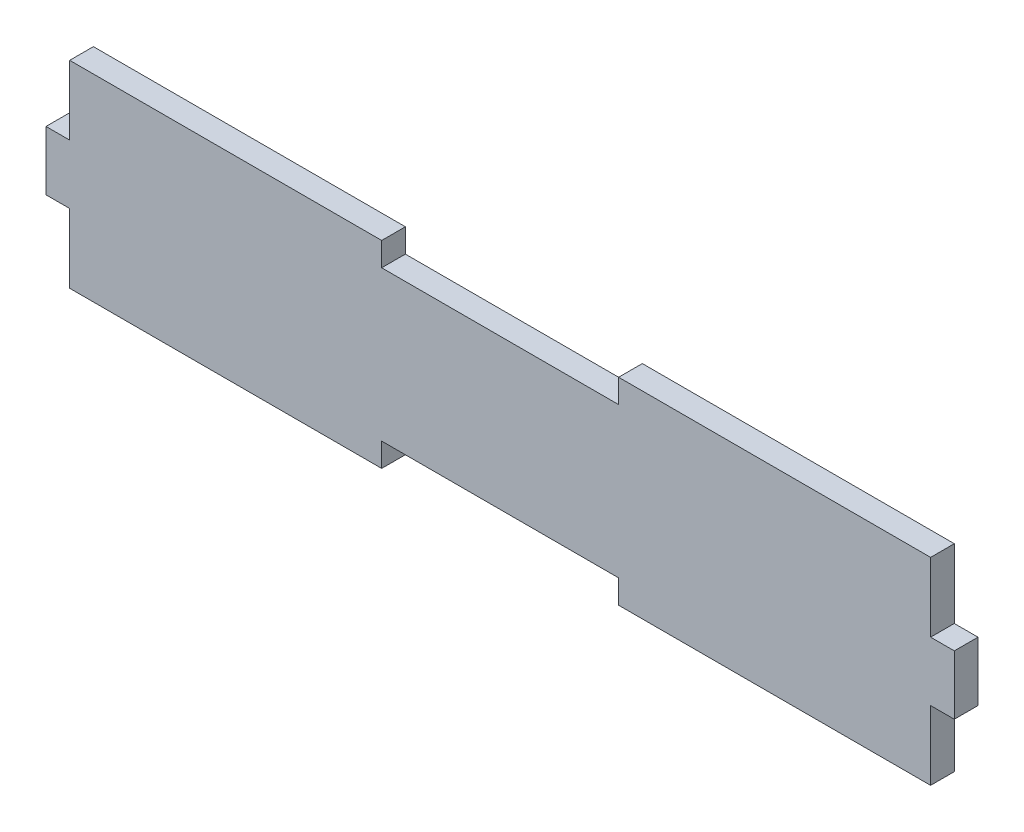
ISO-10303-21;
HEADER;
FILE_DESCRIPTION(('STEP AP214'),'2;1');
FILE_NAME('part.step','',(''),(''),'','','');
FILE_SCHEMA(('AUTOMOTIVE_DESIGN { 1 0 10303 214 1 1 1 1 }'));
ENDSEC;
DATA;
#1=APPLICATION_CONTEXT('core data for automotive mechanical design processes');
#2=APPLICATION_PROTOCOL_DEFINITION('international standard','automotive_design',2000,#1);
#3=PRODUCT_CONTEXT('',#1,'mechanical');
#4=PRODUCT('Part','Part','',(#3));
#5=PRODUCT_RELATED_PRODUCT_CATEGORY('part','',(#4));
#6=PRODUCT_DEFINITION_FORMATION('','',#4);
#7=PRODUCT_DEFINITION_CONTEXT('part definition',#1,'design');
#8=PRODUCT_DEFINITION('design','',#6,#7);
#9=PRODUCT_DEFINITION_SHAPE('','',#8);
#10=(LENGTH_UNIT() NAMED_UNIT(*) SI_UNIT(.MILLI.,.METRE.));
#11=(NAMED_UNIT(*) PLANE_ANGLE_UNIT() SI_UNIT($,.RADIAN.));
#12=(NAMED_UNIT(*) SI_UNIT($,.STERADIAN.) SOLID_ANGLE_UNIT());
#13=UNCERTAINTY_MEASURE_WITH_UNIT(LENGTH_MEASURE(1.E-05),#10,'distance_accuracy_value','');
#14=(GEOMETRIC_REPRESENTATION_CONTEXT(3) GLOBAL_UNCERTAINTY_ASSIGNED_CONTEXT((#13)) GLOBAL_UNIT_ASSIGNED_CONTEXT((#10,
#11,#12)) REPRESENTATION_CONTEXT('',''));
#15=CARTESIAN_POINT('',(0.,0.,0.));
#16=DIRECTION('',(0.,0.,1.));
#17=DIRECTION('',(1.,0.,0.));
#18=AXIS2_PLACEMENT_3D('',#15,#16,#17);
#19=CARTESIAN_POINT('',(-109.,7.49999999999999,6.));
#20=DIRECTION('',(0.,-1.,0.));
#21=DIRECTION('',(1.,0.,0.));
#22=AXIS2_PLACEMENT_3D('',#19,#20,#21);
#23=PLANE('',#22);
#24=DIRECTION('',(-1.,0.,0.));
#25=VECTOR('',#24,1.);
#26=CARTESIAN_POINT('',(-109.,7.49999999999999,0.));
#27=LINE('',#26,#25);
#28=CARTESIAN_POINT('',(-109.,7.49999999999999,0.));
#29=VERTEX_POINT('',#28);
#30=CARTESIAN_POINT('',(-115.,7.49999999999999,0.));
#31=VERTEX_POINT('',#30);
#32=EDGE_CURVE('E200',#29,#31,#27,.T.);
#33=ORIENTED_EDGE('',*,*,#32,.T.);
#34=DIRECTION('',(0.,0.,-1.));
#35=VECTOR('',#34,1.);
#36=CARTESIAN_POINT('',(-115.,7.49999999999999,6.));
#37=LINE('',#36,#35);
#38=CARTESIAN_POINT('',(-115.,7.49999999999999,6.));
#39=VERTEX_POINT('',#38);
#40=EDGE_CURVE('E11',#39,#31,#37,.T.);
#41=ORIENTED_EDGE('',*,*,#40,.F.);
#42=DIRECTION('',(-1.,0.,0.));
#43=VECTOR('',#42,1.);
#44=CARTESIAN_POINT('',(-109.,7.49999999999999,6.));
#45=LINE('',#44,#43);
#46=CARTESIAN_POINT('',(-109.,7.49999999999999,6.));
#47=VERTEX_POINT('',#46);
#48=EDGE_CURVE('E238',#47,#39,#45,.T.);
#49=ORIENTED_EDGE('',*,*,#48,.F.);
#50=DIRECTION('',(0.,0.,-1.));
#51=VECTOR('',#50,1.);
#52=CARTESIAN_POINT('',(-109.,7.49999999999999,6.));
#53=LINE('',#52,#51);
#54=EDGE_CURVE('E196',#47,#29,#53,.T.);
#55=ORIENTED_EDGE('',*,*,#54,.T.);
#56=EDGE_LOOP('',(#33,#41,#49,#55));
#57=FACE_BOUND('',#56,.T.);
#58=ADVANCED_FACE('F32',(#57),#23,.F.);
#59=CARTESIAN_POINT('',(-115.,7.49999999999999,6.));
#60=DIRECTION('',(1.,0.,0.));
#61=DIRECTION('',(0.,0.,-1.));
#62=AXIS2_PLACEMENT_3D('',#59,#60,#61);
#63=PLANE('',#62);
#64=DIRECTION('',(0.,-1.,0.));
#65=VECTOR('',#64,1.);
#66=CARTESIAN_POINT('',(-115.,7.49999999999999,0.));
#67=LINE('',#66,#65);
#68=CARTESIAN_POINT('',(-115.,-7.50000000000001,0.));
#69=VERTEX_POINT('',#68);
#70=EDGE_CURVE('E203',#31,#69,#67,.T.);
#71=ORIENTED_EDGE('',*,*,#70,.T.);
#72=DIRECTION('',(0.,0.,-1.));
#73=VECTOR('',#72,1.);
#74=CARTESIAN_POINT('',(-115.,-7.50000000000001,6.));
#75=LINE('',#74,#73);
#76=CARTESIAN_POINT('',(-115.,-7.50000000000001,6.));
#77=VERTEX_POINT('',#76);
#78=EDGE_CURVE('E40',#77,#69,#75,.T.);
#79=ORIENTED_EDGE('',*,*,#78,.F.);
#80=DIRECTION('',(0.,-1.,0.));
#81=VECTOR('',#80,1.);
#82=CARTESIAN_POINT('',(-115.,7.49999999999999,6.));
#83=LINE('',#82,#81);
#84=EDGE_CURVE('E127',#39,#77,#83,.T.);
#85=ORIENTED_EDGE('',*,*,#84,.F.);
#86=ORIENTED_EDGE('',*,*,#40,.T.);
#87=EDGE_LOOP('',(#71,#79,#85,#86));
#88=FACE_BOUND('',#87,.T.);
#89=ADVANCED_FACE('F356',(#88),#63,.F.);
#90=CARTESIAN_POINT('',(-109.,-7.50000000000001,6.));
#91=DIRECTION('',(0.,1.,0.));
#92=DIRECTION('',(-1.,0.,0.));
#93=AXIS2_PLACEMENT_3D('',#90,#91,#92);
#94=PLANE('',#93);
#95=DIRECTION('',(1.,0.,0.));
#96=VECTOR('',#95,1.);
#97=CARTESIAN_POINT('',(-109.,-7.50000000000001,0.));
#98=LINE('',#97,#96);
#99=CARTESIAN_POINT('',(-109.,-7.50000000000001,0.));
#100=VERTEX_POINT('',#99);
#101=EDGE_CURVE('E205',#69,#100,#98,.T.);
#102=ORIENTED_EDGE('',*,*,#101,.T.);
#103=DIRECTION('',(0.,0.,-1.));
#104=VECTOR('',#103,1.);
#105=CARTESIAN_POINT('',(-109.,-7.50000000000001,6.));
#106=LINE('',#105,#104);
#107=CARTESIAN_POINT('',(-109.,-7.50000000000001,6.));
#108=VERTEX_POINT('',#107);
#109=EDGE_CURVE('E281',#108,#100,#106,.T.);
#110=ORIENTED_EDGE('',*,*,#109,.F.);
#111=DIRECTION('',(1.,0.,0.));
#112=VECTOR('',#111,1.);
#113=CARTESIAN_POINT('',(-109.,-7.50000000000001,6.));
#114=LINE('',#113,#112);
#115=EDGE_CURVE('E289',#77,#108,#114,.T.);
#116=ORIENTED_EDGE('',*,*,#115,.F.);
#117=ORIENTED_EDGE('',*,*,#78,.T.);
#118=EDGE_LOOP('',(#102,#110,#116,#117));
#119=FACE_BOUND('',#118,.T.);
#120=ADVANCED_FACE('F287',(#119),#94,.F.);
#121=CARTESIAN_POINT('',(-109.,-25.,6.));
#122=DIRECTION('',(1.,0.,0.));
#123=DIRECTION('',(0.,0.,-1.));
#124=AXIS2_PLACEMENT_3D('',#121,#122,#123);
#125=PLANE('',#124);
#126=DIRECTION('',(0.,-1.,0.));
#127=VECTOR('',#126,1.);
#128=CARTESIAN_POINT('',(-109.,-25.,0.));
#129=LINE('',#128,#127);
#130=CARTESIAN_POINT('',(-109.,-25.,0.));
#131=VERTEX_POINT('',#130);
#132=EDGE_CURVE('E207',#100,#131,#129,.T.);
#133=ORIENTED_EDGE('',*,*,#132,.T.);
#134=DIRECTION('',(0.,0.,-1.));
#135=VECTOR('',#134,1.);
#136=CARTESIAN_POINT('',(-109.,-25.,6.));
#137=LINE('',#136,#135);
#138=CARTESIAN_POINT('',(-109.,-25.,6.));
#139=VERTEX_POINT('',#138);
#140=EDGE_CURVE('E278',#139,#131,#137,.T.);
#141=ORIENTED_EDGE('',*,*,#140,.F.);
#142=DIRECTION('',(0.,-1.,0.));
#143=VECTOR('',#142,1.);
#144=CARTESIAN_POINT('',(-109.,-25.,6.));
#145=LINE('',#144,#143);
#146=EDGE_CURVE('E307',#108,#139,#145,.T.);
#147=ORIENTED_EDGE('',*,*,#146,.F.);
#148=ORIENTED_EDGE('',*,*,#109,.T.);
#149=EDGE_LOOP('',(#133,#141,#147,#148));
#150=FACE_BOUND('',#149,.T.);
#151=ADVANCED_FACE('F298',(#150),#125,.F.);
#152=CARTESIAN_POINT('',(-30.,-25.,6.));
#153=DIRECTION('',(0.,1.,0.));
#154=DIRECTION('',(-1.,0.,0.));
#155=AXIS2_PLACEMENT_3D('',#152,#153,#154);
#156=PLANE('',#155);
#157=DIRECTION('',(1.,0.,0.));
#158=VECTOR('',#157,1.);
#159=CARTESIAN_POINT('',(-30.,-25.,0.));
#160=LINE('',#159,#158);
#161=CARTESIAN_POINT('',(-30.,-25.,0.));
#162=VERTEX_POINT('',#161);
#163=EDGE_CURVE('E209',#131,#162,#160,.T.);
#164=ORIENTED_EDGE('',*,*,#163,.T.);
#165=DIRECTION('',(0.,0.,-1.));
#166=VECTOR('',#165,1.);
#167=CARTESIAN_POINT('',(-30.,-25.,6.));
#168=LINE('',#167,#166);
#169=CARTESIAN_POINT('',(-30.,-25.,6.));
#170=VERTEX_POINT('',#169);
#171=EDGE_CURVE('E275',#170,#162,#168,.T.);
#172=ORIENTED_EDGE('',*,*,#171,.F.);
#173=DIRECTION('',(1.,0.,0.));
#174=VECTOR('',#173,1.);
#175=CARTESIAN_POINT('',(-30.,-25.,6.));
#176=LINE('',#175,#174);
#177=EDGE_CURVE('E304',#139,#170,#176,.T.);
#178=ORIENTED_EDGE('',*,*,#177,.F.);
#179=ORIENTED_EDGE('',*,*,#140,.T.);
#180=EDGE_LOOP('',(#164,#172,#178,#179));
#181=FACE_BOUND('',#180,.T.);
#182=ADVANCED_FACE('F302',(#181),#156,.F.);
#183=CARTESIAN_POINT('',(-30.,-19.,6.));
#184=DIRECTION('',(-1.,0.,0.));
#185=DIRECTION('',(0.,-1.,0.));
#186=AXIS2_PLACEMENT_3D('',#183,#184,#185);
#187=PLANE('',#186);
#188=DIRECTION('',(0.,1.,0.));
#189=VECTOR('',#188,1.);
#190=CARTESIAN_POINT('',(-30.,-19.,0.));
#191=LINE('',#190,#189);
#192=CARTESIAN_POINT('',(-30.,-19.,0.));
#193=VERTEX_POINT('',#192);
#194=EDGE_CURVE('E211',#162,#193,#191,.T.);
#195=ORIENTED_EDGE('',*,*,#194,.T.);
#196=DIRECTION('',(0.,0.,-1.));
#197=VECTOR('',#196,1.);
#198=CARTESIAN_POINT('',(-30.,-19.,6.));
#199=LINE('',#198,#197);
#200=CARTESIAN_POINT('',(-30.,-19.,6.));
#201=VERTEX_POINT('',#200);
#202=EDGE_CURVE('E272',#201,#193,#199,.T.);
#203=ORIENTED_EDGE('',*,*,#202,.F.);
#204=DIRECTION('',(0.,1.,0.));
#205=VECTOR('',#204,1.);
#206=CARTESIAN_POINT('',(-30.,-19.,6.));
#207=LINE('',#206,#205);
#208=EDGE_CURVE('E306',#170,#201,#207,.T.);
#209=ORIENTED_EDGE('',*,*,#208,.F.);
#210=ORIENTED_EDGE('',*,*,#171,.T.);
#211=EDGE_LOOP('',(#195,#203,#209,#210));
#212=FACE_BOUND('',#211,.T.);
#213=ADVANCED_FACE('F369',(#212),#187,.F.);
#214=CARTESIAN_POINT('',(-30.,-19.,6.));
#215=DIRECTION('',(0.,1.,0.));
#216=DIRECTION('',(-1.,0.,0.));
#217=AXIS2_PLACEMENT_3D('',#214,#215,#216);
#218=PLANE('',#217);
#219=DIRECTION('',(1.,0.,0.));
#220=VECTOR('',#219,1.);
#221=CARTESIAN_POINT('',(-30.,-19.,0.));
#222=LINE('',#221,#220);
#223=CARTESIAN_POINT('',(30.,-19.,0.));
#224=VERTEX_POINT('',#223);
#225=EDGE_CURVE('E213',#193,#224,#222,.T.);
#226=ORIENTED_EDGE('',*,*,#225,.T.);
#227=DIRECTION('',(0.,0.,-1.));
#228=VECTOR('',#227,1.);
#229=CARTESIAN_POINT('',(30.,-19.,6.));
#230=LINE('',#229,#228);
#231=CARTESIAN_POINT('',(30.,-19.,6.));
#232=VERTEX_POINT('',#231);
#233=EDGE_CURVE('E269',#232,#224,#230,.T.);
#234=ORIENTED_EDGE('',*,*,#233,.F.);
#235=DIRECTION('',(1.,0.,0.));
#236=VECTOR('',#235,1.);
#237=CARTESIAN_POINT('',(-30.,-19.,6.));
#238=LINE('',#237,#236);
#239=EDGE_CURVE('E309',#201,#232,#238,.T.);
#240=ORIENTED_EDGE('',*,*,#239,.F.);
#241=ORIENTED_EDGE('',*,*,#202,.T.);
#242=EDGE_LOOP('',(#226,#234,#240,#241));
#243=FACE_BOUND('',#242,.T.);
#244=ADVANCED_FACE('F372',(#243),#218,.F.);
#245=CARTESIAN_POINT('',(30.,-19.,6.));
#246=DIRECTION('',(1.,0.,0.));
#247=DIRECTION('',(0.,1.,0.));
#248=AXIS2_PLACEMENT_3D('',#245,#246,#247);
#249=PLANE('',#248);
#250=DIRECTION('',(0.,-1.,0.));
#251=VECTOR('',#250,1.);
#252=CARTESIAN_POINT('',(30.,-19.,0.));
#253=LINE('',#252,#251);
#254=CARTESIAN_POINT('',(30.,-25.,0.));
#255=VERTEX_POINT('',#254);
#256=EDGE_CURVE('E215',#224,#255,#253,.T.);
#257=ORIENTED_EDGE('',*,*,#256,.T.);
#258=DIRECTION('',(0.,0.,-1.));
#259=VECTOR('',#258,1.);
#260=CARTESIAN_POINT('',(30.,-25.,6.));
#261=LINE('',#260,#259);
#262=CARTESIAN_POINT('',(30.,-25.,6.));
#263=VERTEX_POINT('',#262);
#264=EDGE_CURVE('E266',#263,#255,#261,.T.);
#265=ORIENTED_EDGE('',*,*,#264,.F.);
#266=DIRECTION('',(0.,-1.,0.));
#267=VECTOR('',#266,1.);
#268=CARTESIAN_POINT('',(30.,-19.,6.));
#269=LINE('',#268,#267);
#270=EDGE_CURVE('E315',#232,#263,#269,.T.);
#271=ORIENTED_EDGE('',*,*,#270,.F.);
#272=ORIENTED_EDGE('',*,*,#233,.T.);
#273=EDGE_LOOP('',(#257,#265,#271,#272));
#274=FACE_BOUND('',#273,.T.);
#275=ADVANCED_FACE('F376',(#274),#249,.F.);
#276=CARTESIAN_POINT('',(30.,-25.,6.));
#277=DIRECTION('',(0.,1.,0.));
#278=DIRECTION('',(-1.,0.,0.));
#279=AXIS2_PLACEMENT_3D('',#276,#277,#278);
#280=PLANE('',#279);
#281=DIRECTION('',(1.,0.,0.));
#282=VECTOR('',#281,1.);
#283=CARTESIAN_POINT('',(30.,-25.,0.));
#284=LINE('',#283,#282);
#285=CARTESIAN_POINT('',(109.,-25.,0.));
#286=VERTEX_POINT('',#285);
#287=EDGE_CURVE('E217',#255,#286,#284,.T.);
#288=ORIENTED_EDGE('',*,*,#287,.T.);
#289=DIRECTION('',(0.,0.,-1.));
#290=VECTOR('',#289,1.);
#291=CARTESIAN_POINT('',(109.,-25.,6.));
#292=LINE('',#291,#290);
#293=CARTESIAN_POINT('',(109.,-25.,6.));
#294=VERTEX_POINT('',#293);
#295=EDGE_CURVE('E263',#294,#286,#292,.T.);
#296=ORIENTED_EDGE('',*,*,#295,.F.);
#297=DIRECTION('',(1.,0.,0.));
#298=VECTOR('',#297,1.);
#299=CARTESIAN_POINT('',(30.,-25.,6.));
#300=LINE('',#299,#298);
#301=EDGE_CURVE('E317',#263,#294,#300,.T.);
#302=ORIENTED_EDGE('',*,*,#301,.F.);
#303=ORIENTED_EDGE('',*,*,#264,.T.);
#304=EDGE_LOOP('',(#288,#296,#302,#303));
#305=FACE_BOUND('',#304,.T.);
#306=ADVANCED_FACE('F380',(#305),#280,.F.);
#307=CARTESIAN_POINT('',(109.,-25.,6.));
#308=DIRECTION('',(-1.,0.,0.));
#309=DIRECTION('',(0.,0.,1.));
#310=AXIS2_PLACEMENT_3D('',#307,#308,#309);
#311=PLANE('',#310);
#312=DIRECTION('',(0.,1.,0.));
#313=VECTOR('',#312,1.);
#314=CARTESIAN_POINT('',(109.,-25.,0.));
#315=LINE('',#314,#313);
#316=CARTESIAN_POINT('',(109.,-7.50000000000001,0.));
#317=VERTEX_POINT('',#316);
#318=EDGE_CURVE('E219',#286,#317,#315,.T.);
#319=ORIENTED_EDGE('',*,*,#318,.T.);
#320=DIRECTION('',(0.,0.,-1.));
#321=VECTOR('',#320,1.);
#322=CARTESIAN_POINT('',(109.,-7.50000000000001,6.));
#323=LINE('',#322,#321);
#324=CARTESIAN_POINT('',(109.,-7.50000000000001,6.));
#325=VERTEX_POINT('',#324);
#326=EDGE_CURVE('E260',#325,#317,#323,.T.);
#327=ORIENTED_EDGE('',*,*,#326,.F.);
#328=DIRECTION('',(0.,1.,0.));
#329=VECTOR('',#328,1.);
#330=CARTESIAN_POINT('',(109.,-25.,6.));
#331=LINE('',#330,#329);
#332=EDGE_CURVE('E319',#294,#325,#331,.T.);
#333=ORIENTED_EDGE('',*,*,#332,.F.);
#334=ORIENTED_EDGE('',*,*,#295,.T.);
#335=EDGE_LOOP('',(#319,#327,#333,#334));
#336=FACE_BOUND('',#335,.T.);
#337=ADVANCED_FACE('F384',(#336),#311,.F.);
#338=CARTESIAN_POINT('',(109.,-7.50000000000001,6.));
#339=DIRECTION('',(0.,1.,0.));
#340=DIRECTION('',(-1.,0.,0.));
#341=AXIS2_PLACEMENT_3D('',#338,#339,#340);
#342=PLANE('',#341);
#343=DIRECTION('',(1.,0.,0.));
#344=VECTOR('',#343,1.);
#345=CARTESIAN_POINT('',(109.,-7.50000000000001,0.));
#346=LINE('',#345,#344);
#347=CARTESIAN_POINT('',(115.,-7.50000000000001,0.));
#348=VERTEX_POINT('',#347);
#349=EDGE_CURVE('E221',#317,#348,#346,.T.);
#350=ORIENTED_EDGE('',*,*,#349,.T.);
#351=DIRECTION('',(0.,0.,-1.));
#352=VECTOR('',#351,1.);
#353=CARTESIAN_POINT('',(115.,-7.50000000000001,6.));
#354=LINE('',#353,#352);
#355=CARTESIAN_POINT('',(115.,-7.50000000000001,6.));
#356=VERTEX_POINT('',#355);
#357=EDGE_CURVE('E257',#356,#348,#354,.T.);
#358=ORIENTED_EDGE('',*,*,#357,.F.);
#359=DIRECTION('',(1.,0.,0.));
#360=VECTOR('',#359,1.);
#361=CARTESIAN_POINT('',(109.,-7.50000000000001,6.));
#362=LINE('',#361,#360);
#363=EDGE_CURVE('E321',#325,#356,#362,.T.);
#364=ORIENTED_EDGE('',*,*,#363,.F.);
#365=ORIENTED_EDGE('',*,*,#326,.T.);
#366=EDGE_LOOP('',(#350,#358,#364,#365));
#367=FACE_BOUND('',#366,.T.);
#368=ADVANCED_FACE('F388',(#367),#342,.F.);
#369=CARTESIAN_POINT('',(115.,7.49999999999999,6.));
#370=DIRECTION('',(-1.,0.,0.));
#371=DIRECTION('',(0.,0.,1.));
#372=AXIS2_PLACEMENT_3D('',#369,#370,#371);
#373=PLANE('',#372);
#374=DIRECTION('',(0.,1.,0.));
#375=VECTOR('',#374,1.);
#376=CARTESIAN_POINT('',(115.,7.49999999999999,0.));
#377=LINE('',#376,#375);
#378=CARTESIAN_POINT('',(115.,7.49999999999999,0.));
#379=VERTEX_POINT('',#378);
#380=EDGE_CURVE('E223',#348,#379,#377,.T.);
#381=ORIENTED_EDGE('',*,*,#380,.T.);
#382=DIRECTION('',(0.,0.,-1.));
#383=VECTOR('',#382,1.);
#384=CARTESIAN_POINT('',(115.,7.49999999999999,6.));
#385=LINE('',#384,#383);
#386=CARTESIAN_POINT('',(115.,7.49999999999999,6.));
#387=VERTEX_POINT('',#386);
#388=EDGE_CURVE('E254',#387,#379,#385,.T.);
#389=ORIENTED_EDGE('',*,*,#388,.F.);
#390=DIRECTION('',(0.,1.,0.));
#391=VECTOR('',#390,1.);
#392=CARTESIAN_POINT('',(115.,7.49999999999999,6.));
#393=LINE('',#392,#391);
#394=EDGE_CURVE('E323',#356,#387,#393,.T.);
#395=ORIENTED_EDGE('',*,*,#394,.F.);
#396=ORIENTED_EDGE('',*,*,#357,.T.);
#397=EDGE_LOOP('',(#381,#389,#395,#396));
#398=FACE_BOUND('',#397,.T.);
#399=ADVANCED_FACE('F392',(#398),#373,.F.);
#400=CARTESIAN_POINT('',(109.,7.49999999999999,6.));
#401=DIRECTION('',(0.,-1.,0.));
#402=DIRECTION('',(1.,0.,0.));
#403=AXIS2_PLACEMENT_3D('',#400,#401,#402);
#404=PLANE('',#403);
#405=DIRECTION('',(-1.,0.,0.));
#406=VECTOR('',#405,1.);
#407=CARTESIAN_POINT('',(109.,7.49999999999999,0.));
#408=LINE('',#407,#406);
#409=CARTESIAN_POINT('',(109.,7.49999999999999,0.));
#410=VERTEX_POINT('',#409);
#411=EDGE_CURVE('E225',#379,#410,#408,.T.);
#412=ORIENTED_EDGE('',*,*,#411,.T.);
#413=DIRECTION('',(0.,0.,-1.));
#414=VECTOR('',#413,1.);
#415=CARTESIAN_POINT('',(109.,7.49999999999999,6.));
#416=LINE('',#415,#414);
#417=CARTESIAN_POINT('',(109.,7.49999999999999,6.));
#418=VERTEX_POINT('',#417);
#419=EDGE_CURVE('E251',#418,#410,#416,.T.);
#420=ORIENTED_EDGE('',*,*,#419,.F.);
#421=DIRECTION('',(-1.,0.,0.));
#422=VECTOR('',#421,1.);
#423=CARTESIAN_POINT('',(109.,7.49999999999999,6.));
#424=LINE('',#423,#422);
#425=EDGE_CURVE('E325',#387,#418,#424,.T.);
#426=ORIENTED_EDGE('',*,*,#425,.F.);
#427=ORIENTED_EDGE('',*,*,#388,.T.);
#428=EDGE_LOOP('',(#412,#420,#426,#427));
#429=FACE_BOUND('',#428,.T.);
#430=ADVANCED_FACE('F396',(#429),#404,.F.);
#431=CARTESIAN_POINT('',(109.,7.49999999999999,6.));
#432=DIRECTION('',(-1.,0.,0.));
#433=DIRECTION('',(0.,-1.,0.));
#434=AXIS2_PLACEMENT_3D('',#431,#432,#433);
#435=PLANE('',#434);
#436=DIRECTION('',(0.,1.,0.));
#437=VECTOR('',#436,1.);
#438=CARTESIAN_POINT('',(109.,7.49999999999999,0.));
#439=LINE('',#438,#437);
#440=CARTESIAN_POINT('',(109.,25.,0.));
#441=VERTEX_POINT('',#440);
#442=EDGE_CURVE('E227',#410,#441,#439,.T.);
#443=ORIENTED_EDGE('',*,*,#442,.T.);
#444=DIRECTION('',(0.,0.,-1.));
#445=VECTOR('',#444,1.);
#446=CARTESIAN_POINT('',(109.,25.,6.));
#447=LINE('',#446,#445);
#448=CARTESIAN_POINT('',(109.,25.,6.));
#449=VERTEX_POINT('',#448);
#450=EDGE_CURVE('E248',#449,#441,#447,.T.);
#451=ORIENTED_EDGE('',*,*,#450,.F.);
#452=DIRECTION('',(0.,1.,0.));
#453=VECTOR('',#452,1.);
#454=CARTESIAN_POINT('',(109.,7.49999999999999,6.));
#455=LINE('',#454,#453);
#456=EDGE_CURVE('E327',#418,#449,#455,.T.);
#457=ORIENTED_EDGE('',*,*,#456,.F.);
#458=ORIENTED_EDGE('',*,*,#419,.T.);
#459=EDGE_LOOP('',(#443,#451,#457,#458));
#460=FACE_BOUND('',#459,.T.);
#461=ADVANCED_FACE('F400',(#460),#435,.F.);
#462=CARTESIAN_POINT('',(30.,25.,6.));
#463=DIRECTION('',(0.,-1.,0.));
#464=DIRECTION('',(1.,0.,0.));
#465=AXIS2_PLACEMENT_3D('',#462,#463,#464);
#466=PLANE('',#465);
#467=DIRECTION('',(-1.,0.,0.));
#468=VECTOR('',#467,1.);
#469=CARTESIAN_POINT('',(30.,25.,0.));
#470=LINE('',#469,#468);
#471=CARTESIAN_POINT('',(30.,25.,0.));
#472=VERTEX_POINT('',#471);
#473=EDGE_CURVE('E229',#441,#472,#470,.T.);
#474=ORIENTED_EDGE('',*,*,#473,.T.);
#475=DIRECTION('',(0.,0.,-1.));
#476=VECTOR('',#475,1.);
#477=CARTESIAN_POINT('',(30.,25.,6.));
#478=LINE('',#477,#476);
#479=CARTESIAN_POINT('',(30.,25.,6.));
#480=VERTEX_POINT('',#479);
#481=EDGE_CURVE('E245',#480,#472,#478,.T.);
#482=ORIENTED_EDGE('',*,*,#481,.F.);
#483=DIRECTION('',(-1.,0.,0.));
#484=VECTOR('',#483,1.);
#485=CARTESIAN_POINT('',(30.,25.,6.));
#486=LINE('',#485,#484);
#487=EDGE_CURVE('E329',#449,#480,#486,.T.);
#488=ORIENTED_EDGE('',*,*,#487,.F.);
#489=ORIENTED_EDGE('',*,*,#450,.T.);
#490=EDGE_LOOP('',(#474,#482,#488,#489));
#491=FACE_BOUND('',#490,.T.);
#492=ADVANCED_FACE('F404',(#491),#466,.F.);
#493=CARTESIAN_POINT('',(30.,19.,6.));
#494=DIRECTION('',(1.,0.,0.));
#495=DIRECTION('',(0.,1.,0.));
#496=AXIS2_PLACEMENT_3D('',#493,#494,#495);
#497=PLANE('',#496);
#498=DIRECTION('',(0.,-1.,0.));
#499=VECTOR('',#498,1.);
#500=CARTESIAN_POINT('',(30.,19.,0.));
#501=LINE('',#500,#499);
#502=CARTESIAN_POINT('',(30.,19.,0.));
#503=VERTEX_POINT('',#502);
#504=EDGE_CURVE('E231',#472,#503,#501,.T.);
#505=ORIENTED_EDGE('',*,*,#504,.T.);
#506=DIRECTION('',(0.,0.,-1.));
#507=VECTOR('',#506,1.);
#508=CARTESIAN_POINT('',(30.,19.,6.));
#509=LINE('',#508,#507);
#510=CARTESIAN_POINT('',(30.,19.,6.));
#511=VERTEX_POINT('',#510);
#512=EDGE_CURVE('E242',#511,#503,#509,.T.);
#513=ORIENTED_EDGE('',*,*,#512,.F.);
#514=DIRECTION('',(0.,-1.,0.));
#515=VECTOR('',#514,1.);
#516=CARTESIAN_POINT('',(30.,19.,6.));
#517=LINE('',#516,#515);
#518=EDGE_CURVE('E331',#480,#511,#517,.T.);
#519=ORIENTED_EDGE('',*,*,#518,.F.);
#520=ORIENTED_EDGE('',*,*,#481,.T.);
#521=EDGE_LOOP('',(#505,#513,#519,#520));
#522=FACE_BOUND('',#521,.T.);
#523=ADVANCED_FACE('F337',(#522),#497,.F.);
#524=CARTESIAN_POINT('',(-30.,19.,6.));
#525=DIRECTION('',(0.,-1.,0.));
#526=DIRECTION('',(0.,0.,-1.));
#527=AXIS2_PLACEMENT_3D('',#524,#525,#526);
#528=PLANE('',#527);
#529=DIRECTION('',(-1.,0.,0.));
#530=VECTOR('',#529,1.);
#531=CARTESIAN_POINT('',(-30.,19.,0.));
#532=LINE('',#531,#530);
#533=CARTESIAN_POINT('',(-30.,19.,0.));
#534=VERTEX_POINT('',#533);
#535=EDGE_CURVE('E233',#503,#534,#532,.T.);
#536=ORIENTED_EDGE('',*,*,#535,.T.);
#537=DIRECTION('',(0.,0.,-1.));
#538=VECTOR('',#537,1.);
#539=CARTESIAN_POINT('',(-30.,19.,6.));
#540=LINE('',#539,#538);
#541=CARTESIAN_POINT('',(-30.,19.,6.));
#542=VERTEX_POINT('',#541);
#543=EDGE_CURVE('E191',#542,#534,#540,.T.);
#544=ORIENTED_EDGE('',*,*,#543,.F.);
#545=DIRECTION('',(-1.,0.,0.));
#546=VECTOR('',#545,1.);
#547=CARTESIAN_POINT('',(-30.,19.,6.));
#548=LINE('',#547,#546);
#549=EDGE_CURVE('E182',#511,#542,#548,.T.);
#550=ORIENTED_EDGE('',*,*,#549,.F.);
#551=ORIENTED_EDGE('',*,*,#512,.T.);
#552=EDGE_LOOP('',(#536,#544,#550,#551));
#553=FACE_BOUND('',#552,.T.);
#554=ADVANCED_FACE('F341',(#553),#528,.F.);
#555=CARTESIAN_POINT('',(-30.,19.,6.));
#556=DIRECTION('',(-1.,0.,0.));
#557=DIRECTION('',(0.,-1.,0.));
#558=AXIS2_PLACEMENT_3D('',#555,#556,#557);
#559=PLANE('',#558);
#560=DIRECTION('',(0.,1.,0.));
#561=VECTOR('',#560,1.);
#562=CARTESIAN_POINT('',(-30.,19.,0.));
#563=LINE('',#562,#561);
#564=CARTESIAN_POINT('',(-30.,25.,0.));
#565=VERTEX_POINT('',#564);
#566=EDGE_CURVE('E190',#534,#565,#563,.T.);
#567=ORIENTED_EDGE('',*,*,#566,.T.);
#568=DIRECTION('',(0.,0.,-1.));
#569=VECTOR('',#568,1.);
#570=CARTESIAN_POINT('',(-30.,25.,6.));
#571=LINE('',#570,#569);
#572=CARTESIAN_POINT('',(-30.,25.,6.));
#573=VERTEX_POINT('',#572);
#574=EDGE_CURVE('E187',#573,#565,#571,.T.);
#575=ORIENTED_EDGE('',*,*,#574,.F.);
#576=DIRECTION('',(0.,1.,0.));
#577=VECTOR('',#576,1.);
#578=CARTESIAN_POINT('',(-30.,19.,6.));
#579=LINE('',#578,#577);
#580=EDGE_CURVE('E176',#542,#573,#579,.T.);
#581=ORIENTED_EDGE('',*,*,#580,.F.);
#582=ORIENTED_EDGE('',*,*,#543,.T.);
#583=EDGE_LOOP('',(#567,#575,#581,#582));
#584=FACE_BOUND('',#583,.T.);
#585=ADVANCED_FACE('F188',(#584),#559,.F.);
#586=CARTESIAN_POINT('',(-30.,25.,6.));
#587=DIRECTION('',(0.,-1.,0.));
#588=DIRECTION('',(1.,0.,0.));
#589=AXIS2_PLACEMENT_3D('',#586,#587,#588);
#590=PLANE('',#589);
#591=DIRECTION('',(-1.,0.,0.));
#592=VECTOR('',#591,1.);
#593=CARTESIAN_POINT('',(-30.,25.,0.));
#594=LINE('',#593,#592);
#595=CARTESIAN_POINT('',(-109.,25.,0.));
#596=VERTEX_POINT('',#595);
#597=EDGE_CURVE('E113',#565,#596,#594,.T.);
#598=ORIENTED_EDGE('',*,*,#597,.T.);
#599=DIRECTION('',(0.,0.,-1.));
#600=VECTOR('',#599,1.);
#601=CARTESIAN_POINT('',(-109.,25.,6.));
#602=LINE('',#601,#600);
#603=CARTESIAN_POINT('',(-109.,25.,6.));
#604=VERTEX_POINT('',#603);
#605=EDGE_CURVE('E192',#604,#596,#602,.T.);
#606=ORIENTED_EDGE('',*,*,#605,.F.);
#607=DIRECTION('',(-1.,0.,0.));
#608=VECTOR('',#607,1.);
#609=CARTESIAN_POINT('',(-30.,25.,6.));
#610=LINE('',#609,#608);
#611=EDGE_CURVE('E180',#573,#604,#610,.T.);
#612=ORIENTED_EDGE('',*,*,#611,.F.);
#613=ORIENTED_EDGE('',*,*,#574,.T.);
#614=EDGE_LOOP('',(#598,#606,#612,#613));
#615=FACE_BOUND('',#614,.T.);
#616=ADVANCED_FACE('F194',(#615),#590,.F.);
#617=CARTESIAN_POINT('',(-109.,7.49999999999999,6.));
#618=DIRECTION('',(1.,0.,0.));
#619=DIRECTION('',(0.,1.,0.));
#620=AXIS2_PLACEMENT_3D('',#617,#618,#619);
#621=PLANE('',#620);
#622=DIRECTION('',(0.,-1.,0.));
#623=VECTOR('',#622,1.);
#624=CARTESIAN_POINT('',(-109.,7.49999999999999,0.));
#625=LINE('',#624,#623);
#626=EDGE_CURVE('E119',#596,#29,#625,.T.);
#627=ORIENTED_EDGE('',*,*,#626,.T.);
#628=ORIENTED_EDGE('',*,*,#54,.F.);
#629=DIRECTION('',(0.,-1.,0.));
#630=VECTOR('',#629,1.);
#631=CARTESIAN_POINT('',(-109.,7.49999999999999,6.));
#632=LINE('',#631,#630);
#633=EDGE_CURVE('E48',#604,#47,#632,.T.);
#634=ORIENTED_EDGE('',*,*,#633,.F.);
#635=ORIENTED_EDGE('',*,*,#605,.T.);
#636=EDGE_LOOP('',(#627,#628,#634,#635));
#637=FACE_BOUND('',#636,.T.);
#638=ADVANCED_FACE('F345',(#637),#621,.F.);
#639=CARTESIAN_POINT('',(0.,0.,6.));
#640=DIRECTION('',(0.,0.,1.));
#641=DIRECTION('',(1.,0.,0.));
#642=AXIS2_PLACEMENT_3D('',#639,#640,#641);
#643=PLANE('',#642);
#644=ORIENTED_EDGE('',*,*,#48,.T.);
#645=ORIENTED_EDGE('',*,*,#84,.T.);
#646=ORIENTED_EDGE('',*,*,#115,.T.);
#647=ORIENTED_EDGE('',*,*,#146,.T.);
#648=ORIENTED_EDGE('',*,*,#177,.T.);
#649=ORIENTED_EDGE('',*,*,#208,.T.);
#650=ORIENTED_EDGE('',*,*,#239,.T.);
#651=ORIENTED_EDGE('',*,*,#270,.T.);
#652=ORIENTED_EDGE('',*,*,#301,.T.);
#653=ORIENTED_EDGE('',*,*,#332,.T.);
#654=ORIENTED_EDGE('',*,*,#363,.T.);
#655=ORIENTED_EDGE('',*,*,#394,.T.);
#656=ORIENTED_EDGE('',*,*,#425,.T.);
#657=ORIENTED_EDGE('',*,*,#456,.T.);
#658=ORIENTED_EDGE('',*,*,#487,.T.);
#659=ORIENTED_EDGE('',*,*,#518,.T.);
#660=ORIENTED_EDGE('',*,*,#549,.T.);
#661=ORIENTED_EDGE('',*,*,#580,.T.);
#662=ORIENTED_EDGE('',*,*,#611,.T.);
#663=ORIENTED_EDGE('',*,*,#633,.T.);
#664=EDGE_LOOP('',(#644,#645,#646,#647,#648,#649,#650,#651,#652,#653,#654,#655,#656,#657,#658,
#659,#660,#661,#662,#663));
#665=FACE_BOUND('',#664,.T.);
#666=ADVANCED_FACE('F178',(#665),#643,.T.);
#667=CARTESIAN_POINT('',(0.,0.,0.));
#668=DIRECTION('',(0.,0.,1.));
#669=DIRECTION('',(1.,0.,0.));
#670=AXIS2_PLACEMENT_3D('',#667,#668,#669);
#671=PLANE('',#670);
#672=ORIENTED_EDGE('',*,*,#32,.F.);
#673=ORIENTED_EDGE('',*,*,#626,.F.);
#674=ORIENTED_EDGE('',*,*,#597,.F.);
#675=ORIENTED_EDGE('',*,*,#566,.F.);
#676=ORIENTED_EDGE('',*,*,#535,.F.);
#677=ORIENTED_EDGE('',*,*,#504,.F.);
#678=ORIENTED_EDGE('',*,*,#473,.F.);
#679=ORIENTED_EDGE('',*,*,#442,.F.);
#680=ORIENTED_EDGE('',*,*,#411,.F.);
#681=ORIENTED_EDGE('',*,*,#380,.F.);
#682=ORIENTED_EDGE('',*,*,#349,.F.);
#683=ORIENTED_EDGE('',*,*,#318,.F.);
#684=ORIENTED_EDGE('',*,*,#287,.F.);
#685=ORIENTED_EDGE('',*,*,#256,.F.);
#686=ORIENTED_EDGE('',*,*,#225,.F.);
#687=ORIENTED_EDGE('',*,*,#194,.F.);
#688=ORIENTED_EDGE('',*,*,#163,.F.);
#689=ORIENTED_EDGE('',*,*,#132,.F.);
#690=ORIENTED_EDGE('',*,*,#101,.F.);
#691=ORIENTED_EDGE('',*,*,#70,.F.);
#692=EDGE_LOOP('',(#672,#673,#674,#675,#676,#677,#678,#679,#680,#681,#682,#683,#684,#685,#686,
#687,#688,#689,#690,#691));
#693=FACE_BOUND('',#692,.T.);
#694=ADVANCED_FACE('F293',(#693),#671,.F.);
#695=CLOSED_SHELL('',(#58,#89,#120,#151,#182,#213,#244,#275,#306,#337,#368,#399,#430,#461,#492,
#523,#554,#585,#616,#638,#666,#694));
#696=MANIFOLD_SOLID_BREP('B2',#695);
#697=ADVANCED_BREP_SHAPE_REPRESENTATION('',(#18,#696),#14);
#698=SHAPE_DEFINITION_REPRESENTATION(#9,#697);
ENDSEC;
END-ISO-10303-21;
